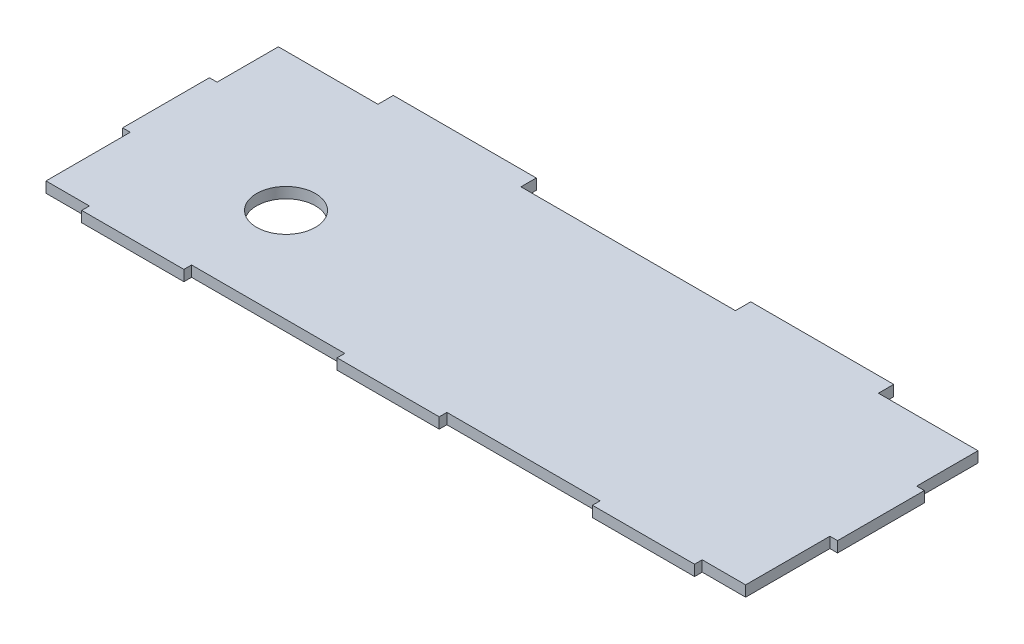
ISO-10303-21;
HEADER;
FILE_DESCRIPTION(('STEP AP214'),'2;1');
FILE_NAME('part.step','',(''),(''),'','','');
FILE_SCHEMA(('AUTOMOTIVE_DESIGN { 1 0 10303 214 1 1 1 1 }'));
ENDSEC;
DATA;
#1=APPLICATION_CONTEXT('core data for automotive mechanical design processes');
#2=APPLICATION_PROTOCOL_DEFINITION('international standard','automotive_design',2000,#1);
#3=PRODUCT_CONTEXT('',#1,'mechanical');
#4=PRODUCT('Part','Part','',(#3));
#5=PRODUCT_RELATED_PRODUCT_CATEGORY('part','',(#4));
#6=PRODUCT_DEFINITION_FORMATION('','',#4);
#7=PRODUCT_DEFINITION_CONTEXT('part definition',#1,'design');
#8=PRODUCT_DEFINITION('design','',#6,#7);
#9=PRODUCT_DEFINITION_SHAPE('','',#8);
#10=(LENGTH_UNIT() NAMED_UNIT(*) SI_UNIT(.MILLI.,.METRE.));
#11=(NAMED_UNIT(*) PLANE_ANGLE_UNIT() SI_UNIT($,.RADIAN.));
#12=(NAMED_UNIT(*) SI_UNIT($,.STERADIAN.) SOLID_ANGLE_UNIT());
#13=UNCERTAINTY_MEASURE_WITH_UNIT(LENGTH_MEASURE(1.E-05),#10,'distance_accuracy_value','');
#14=(GEOMETRIC_REPRESENTATION_CONTEXT(3) GLOBAL_UNCERTAINTY_ASSIGNED_CONTEXT((#13)) GLOBAL_UNIT_ASSIGNED_CONTEXT((#10,
#11,#12)) REPRESENTATION_CONTEXT('',''));
#15=CARTESIAN_POINT('',(0.,0.,0.));
#16=DIRECTION('',(0.,0.,1.));
#17=DIRECTION('',(1.,0.,0.));
#18=AXIS2_PLACEMENT_3D('',#15,#16,#17);
#19=CARTESIAN_POINT('',(-70.,2.1,23.5));
#20=DIRECTION('',(0.,0.,-1.));
#21=DIRECTION('',(-1.,0.,0.));
#22=AXIS2_PLACEMENT_3D('',#19,#20,#21);
#23=PLANE('',#22);
#24=DIRECTION('',(1.,0.,0.));
#25=VECTOR('',#24,1.);
#26=CARTESIAN_POINT('',(-70.,0.,23.5));
#27=LINE('',#26,#25);
#28=CARTESIAN_POINT('',(-9.99999999999998,0.,23.5));
#29=VERTEX_POINT('',#28);
#30=CARTESIAN_POINT('',(10.,0.,23.5));
#31=VERTEX_POINT('',#30);
#32=EDGE_CURVE('E468',#29,#31,#27,.T.);
#33=ORIENTED_EDGE('',*,*,#32,.T.);
#34=DIRECTION('',(0.,1.,0.));
#35=VECTOR('',#34,1.);
#36=CARTESIAN_POINT('',(10.,0.,23.5));
#37=LINE('',#36,#35);
#38=CARTESIAN_POINT('',(10.,2.1,23.5));
#39=VERTEX_POINT('',#38);
#40=EDGE_CURVE('E327',#31,#39,#37,.T.);
#41=ORIENTED_EDGE('',*,*,#40,.T.);
#42=DIRECTION('',(1.,0.,0.));
#43=VECTOR('',#42,1.);
#44=CARTESIAN_POINT('',(-70.,2.1,23.5));
#45=LINE('',#44,#43);
#46=CARTESIAN_POINT('',(-9.99999999999998,2.1,23.5));
#47=VERTEX_POINT('',#46);
#48=EDGE_CURVE('E438',#47,#39,#45,.T.);
#49=ORIENTED_EDGE('',*,*,#48,.F.);
#50=DIRECTION('',(0.,1.,0.));
#51=VECTOR('',#50,1.);
#52=CARTESIAN_POINT('',(-9.99999999999998,0.,23.5));
#53=LINE('',#52,#51);
#54=EDGE_CURVE('E294',#29,#47,#53,.T.);
#55=ORIENTED_EDGE('',*,*,#54,.F.);
#56=EDGE_LOOP('',(#33,#41,#49,#55));
#57=FACE_BOUND('',#56,.T.);
#58=ADVANCED_FACE('F37',(#57),#23,.F.);
#59=CARTESIAN_POINT('',(-60.,0.,23.5));
#60=VERTEX_POINT('',#59);
#61=CARTESIAN_POINT('',(-40.,0.,23.5));
#62=VERTEX_POINT('',#61);
#63=EDGE_CURVE('E469',#60,#62,#27,.T.);
#64=ORIENTED_EDGE('',*,*,#63,.T.);
#65=DIRECTION('',(0.,1.,0.));
#66=VECTOR('',#65,1.);
#67=CARTESIAN_POINT('',(-40.,0.,23.5));
#68=LINE('',#67,#66);
#69=CARTESIAN_POINT('',(-40.,2.1,23.5));
#70=VERTEX_POINT('',#69);
#71=EDGE_CURVE('E301',#62,#70,#68,.T.);
#72=ORIENTED_EDGE('',*,*,#71,.T.);
#73=CARTESIAN_POINT('',(-60.,2.1,23.5));
#74=VERTEX_POINT('',#73);
#75=EDGE_CURVE('E439',#74,#70,#45,.T.);
#76=ORIENTED_EDGE('',*,*,#75,.F.);
#77=DIRECTION('',(0.,1.,0.));
#78=VECTOR('',#77,1.);
#79=CARTESIAN_POINT('',(-60.,0.,23.5));
#80=LINE('',#79,#78);
#81=EDGE_CURVE('E572',#60,#74,#80,.T.);
#82=ORIENTED_EDGE('',*,*,#81,.F.);
#83=EDGE_LOOP('',(#64,#72,#76,#82));
#84=FACE_BOUND('',#83,.T.);
#85=ADVANCED_FACE('F571',(#84),#23,.F.);
#86=CARTESIAN_POINT('',(49.,2.1,-23.5));
#87=DIRECTION('',(0.,0.,1.));
#88=DIRECTION('',(1.,0.,0.));
#89=AXIS2_PLACEMENT_3D('',#86,#87,#88);
#90=PLANE('',#89);
#91=DIRECTION('',(-1.,0.,0.));
#92=VECTOR('',#91,1.);
#93=CARTESIAN_POINT('',(49.,2.1,-23.5));
#94=LINE('',#93,#92);
#95=CARTESIAN_POINT('',(68.5,2.1,-23.5));
#96=VERTEX_POINT('',#95);
#97=CARTESIAN_POINT('',(49.,2.1,-23.5));
#98=VERTEX_POINT('',#97);
#99=EDGE_CURVE('E414',#96,#98,#94,.T.);
#100=ORIENTED_EDGE('',*,*,#99,.F.);
#101=DIRECTION('',(0.,1.,0.));
#102=VECTOR('',#101,1.);
#103=CARTESIAN_POINT('',(68.5,0.,-23.5));
#104=LINE('',#103,#102);
#105=CARTESIAN_POINT('',(68.5,0.,-23.5));
#106=VERTEX_POINT('',#105);
#107=EDGE_CURVE('E378',#106,#96,#104,.T.);
#108=ORIENTED_EDGE('',*,*,#107,.F.);
#109=DIRECTION('',(-1.,0.,0.));
#110=VECTOR('',#109,1.);
#111=CARTESIAN_POINT('',(49.,0.,-23.5));
#112=LINE('',#111,#110);
#113=CARTESIAN_POINT('',(49.,0.,-23.5));
#114=VERTEX_POINT('',#113);
#115=EDGE_CURVE('E411',#106,#114,#112,.T.);
#116=ORIENTED_EDGE('',*,*,#115,.T.);
#117=DIRECTION('',(0.,-1.,0.));
#118=VECTOR('',#117,1.);
#119=CARTESIAN_POINT('',(49.,2.1,-23.5));
#120=LINE('',#119,#118);
#121=EDGE_CURVE('E11',#98,#114,#120,.T.);
#122=ORIENTED_EDGE('',*,*,#121,.F.);
#123=EDGE_LOOP('',(#100,#108,#116,#122));
#124=FACE_BOUND('',#123,.T.);
#125=ADVANCED_FACE('F39',(#124),#90,.F.);
#126=CARTESIAN_POINT('',(49.,2.1,-26.5));
#127=DIRECTION('',(-1.,0.,0.));
#128=DIRECTION('',(0.,0.,1.));
#129=AXIS2_PLACEMENT_3D('',#126,#127,#128);
#130=PLANE('',#129);
#131=DIRECTION('',(0.,0.,-1.));
#132=VECTOR('',#131,1.);
#133=CARTESIAN_POINT('',(49.,0.,-26.5));
#134=LINE('',#133,#132);
#135=CARTESIAN_POINT('',(49.,0.,-26.5));
#136=VERTEX_POINT('',#135);
#137=EDGE_CURVE('E445',#114,#136,#134,.T.);
#138=ORIENTED_EDGE('',*,*,#137,.T.);
#139=DIRECTION('',(0.,-1.,0.));
#140=VECTOR('',#139,1.);
#141=CARTESIAN_POINT('',(49.,2.1,-26.5));
#142=LINE('',#141,#140);
#143=CARTESIAN_POINT('',(49.,2.1,-26.5));
#144=VERTEX_POINT('',#143);
#145=EDGE_CURVE('E45',#144,#136,#142,.T.);
#146=ORIENTED_EDGE('',*,*,#145,.F.);
#147=DIRECTION('',(0.,0.,-1.));
#148=VECTOR('',#147,1.);
#149=CARTESIAN_POINT('',(49.,2.1,-26.5));
#150=LINE('',#149,#148);
#151=EDGE_CURVE('E416',#98,#144,#150,.T.);
#152=ORIENTED_EDGE('',*,*,#151,.F.);
#153=ORIENTED_EDGE('',*,*,#121,.T.);
#154=EDGE_LOOP('',(#138,#146,#152,#153));
#155=FACE_BOUND('',#154,.T.);
#156=ADVANCED_FACE('F517',(#155),#130,.F.);
#157=CARTESIAN_POINT('',(21.,2.1,-26.5));
#158=DIRECTION('',(0.,0.,1.));
#159=DIRECTION('',(1.,0.,0.));
#160=AXIS2_PLACEMENT_3D('',#157,#158,#159);
#161=PLANE('',#160);
#162=DIRECTION('',(-1.,0.,0.));
#163=VECTOR('',#162,1.);
#164=CARTESIAN_POINT('',(21.,0.,-26.5));
#165=LINE('',#164,#163);
#166=CARTESIAN_POINT('',(21.,0.,-26.5));
#167=VERTEX_POINT('',#166);
#168=EDGE_CURVE('E447',#136,#167,#165,.T.);
#169=ORIENTED_EDGE('',*,*,#168,.T.);
#170=DIRECTION('',(0.,-1.,0.));
#171=VECTOR('',#170,1.);
#172=CARTESIAN_POINT('',(21.,2.1,-26.5));
#173=LINE('',#172,#171);
#174=CARTESIAN_POINT('',(21.,2.1,-26.5));
#175=VERTEX_POINT('',#174);
#176=EDGE_CURVE('E486',#175,#167,#173,.T.);
#177=ORIENTED_EDGE('',*,*,#176,.F.);
#178=DIRECTION('',(-1.,0.,0.));
#179=VECTOR('',#178,1.);
#180=CARTESIAN_POINT('',(21.,2.1,-26.5));
#181=LINE('',#180,#179);
#182=EDGE_CURVE('E419',#144,#175,#181,.T.);
#183=ORIENTED_EDGE('',*,*,#182,.F.);
#184=ORIENTED_EDGE('',*,*,#145,.T.);
#185=EDGE_LOOP('',(#169,#177,#183,#184));
#186=FACE_BOUND('',#185,.T.);
#187=ADVANCED_FACE('F493',(#186),#161,.F.);
#188=CARTESIAN_POINT('',(21.,2.1,-23.5));
#189=DIRECTION('',(1.,0.,0.));
#190=DIRECTION('',(0.,0.,-1.));
#191=AXIS2_PLACEMENT_3D('',#188,#189,#190);
#192=PLANE('',#191);
#193=DIRECTION('',(0.,0.,1.));
#194=VECTOR('',#193,1.);
#195=CARTESIAN_POINT('',(21.,0.,-23.5));
#196=LINE('',#195,#194);
#197=CARTESIAN_POINT('',(21.,0.,-23.5));
#198=VERTEX_POINT('',#197);
#199=EDGE_CURVE('E449',#167,#198,#196,.T.);
#200=ORIENTED_EDGE('',*,*,#199,.T.);
#201=DIRECTION('',(0.,-1.,0.));
#202=VECTOR('',#201,1.);
#203=CARTESIAN_POINT('',(21.,2.1,-23.5));
#204=LINE('',#203,#202);
#205=CARTESIAN_POINT('',(21.,2.1,-23.5));
#206=VERTEX_POINT('',#205);
#207=EDGE_CURVE('E483',#206,#198,#204,.T.);
#208=ORIENTED_EDGE('',*,*,#207,.F.);
#209=DIRECTION('',(0.,0.,1.));
#210=VECTOR('',#209,1.);
#211=CARTESIAN_POINT('',(21.,2.1,-23.5));
#212=LINE('',#211,#210);
#213=EDGE_CURVE('E421',#175,#206,#212,.T.);
#214=ORIENTED_EDGE('',*,*,#213,.F.);
#215=ORIENTED_EDGE('',*,*,#176,.T.);
#216=EDGE_LOOP('',(#200,#208,#214,#215));
#217=FACE_BOUND('',#216,.T.);
#218=ADVANCED_FACE('F506',(#217),#192,.F.);
#219=CARTESIAN_POINT('',(-21.,2.1,-23.5));
#220=DIRECTION('',(0.,0.,1.));
#221=DIRECTION('',(1.,0.,0.));
#222=AXIS2_PLACEMENT_3D('',#219,#220,#221);
#223=PLANE('',#222);
#224=DIRECTION('',(-1.,0.,0.));
#225=VECTOR('',#224,1.);
#226=CARTESIAN_POINT('',(-21.,0.,-23.5));
#227=LINE('',#226,#225);
#228=CARTESIAN_POINT('',(-21.,0.,-23.5));
#229=VERTEX_POINT('',#228);
#230=EDGE_CURVE('E451',#198,#229,#227,.T.);
#231=ORIENTED_EDGE('',*,*,#230,.T.);
#232=DIRECTION('',(0.,-1.,0.));
#233=VECTOR('',#232,1.);
#234=CARTESIAN_POINT('',(-21.,2.1,-23.5));
#235=LINE('',#234,#233);
#236=CARTESIAN_POINT('',(-21.,2.1,-23.5));
#237=VERTEX_POINT('',#236);
#238=EDGE_CURVE('E480',#237,#229,#235,.T.);
#239=ORIENTED_EDGE('',*,*,#238,.F.);
#240=DIRECTION('',(-1.,0.,0.));
#241=VECTOR('',#240,1.);
#242=CARTESIAN_POINT('',(-21.,2.1,-23.5));
#243=LINE('',#242,#241);
#244=EDGE_CURVE('E423',#206,#237,#243,.T.);
#245=ORIENTED_EDGE('',*,*,#244,.F.);
#246=ORIENTED_EDGE('',*,*,#207,.T.);
#247=EDGE_LOOP('',(#231,#239,#245,#246));
#248=FACE_BOUND('',#247,.T.);
#249=ADVANCED_FACE('F510',(#248),#223,.F.);
#250=CARTESIAN_POINT('',(-21.,2.1,-26.5));
#251=DIRECTION('',(-1.,0.,0.));
#252=DIRECTION('',(0.,0.,1.));
#253=AXIS2_PLACEMENT_3D('',#250,#251,#252);
#254=PLANE('',#253);
#255=DIRECTION('',(0.,0.,-1.));
#256=VECTOR('',#255,1.);
#257=CARTESIAN_POINT('',(-21.,0.,-26.5));
#258=LINE('',#257,#256);
#259=CARTESIAN_POINT('',(-21.,0.,-26.5));
#260=VERTEX_POINT('',#259);
#261=EDGE_CURVE('E453',#229,#260,#258,.T.);
#262=ORIENTED_EDGE('',*,*,#261,.T.);
#263=DIRECTION('',(0.,-1.,0.));
#264=VECTOR('',#263,1.);
#265=CARTESIAN_POINT('',(-21.,2.1,-26.5));
#266=LINE('',#265,#264);
#267=CARTESIAN_POINT('',(-21.,2.1,-26.5));
#268=VERTEX_POINT('',#267);
#269=EDGE_CURVE('E477',#268,#260,#266,.T.);
#270=ORIENTED_EDGE('',*,*,#269,.F.);
#271=DIRECTION('',(0.,0.,-1.));
#272=VECTOR('',#271,1.);
#273=CARTESIAN_POINT('',(-21.,2.1,-26.5));
#274=LINE('',#273,#272);
#275=EDGE_CURVE('E425',#237,#268,#274,.T.);
#276=ORIENTED_EDGE('',*,*,#275,.F.);
#277=ORIENTED_EDGE('',*,*,#238,.T.);
#278=EDGE_LOOP('',(#262,#270,#276,#277));
#279=FACE_BOUND('',#278,.T.);
#280=ADVANCED_FACE('F619',(#279),#254,.F.);
#281=CARTESIAN_POINT('',(-49.,2.1,-26.5));
#282=DIRECTION('',(0.,0.,1.));
#283=DIRECTION('',(1.,0.,0.));
#284=AXIS2_PLACEMENT_3D('',#281,#282,#283);
#285=PLANE('',#284);
#286=DIRECTION('',(-1.,0.,0.));
#287=VECTOR('',#286,1.);
#288=CARTESIAN_POINT('',(-49.,0.,-26.5));
#289=LINE('',#288,#287);
#290=CARTESIAN_POINT('',(-49.,0.,-26.5));
#291=VERTEX_POINT('',#290);
#292=EDGE_CURVE('E455',#260,#291,#289,.T.);
#293=ORIENTED_EDGE('',*,*,#292,.T.);
#294=DIRECTION('',(0.,-1.,0.));
#295=VECTOR('',#294,1.);
#296=CARTESIAN_POINT('',(-49.,2.1,-26.5));
#297=LINE('',#296,#295);
#298=CARTESIAN_POINT('',(-49.,2.1,-26.5));
#299=VERTEX_POINT('',#298);
#300=EDGE_CURVE('E474',#299,#291,#297,.T.);
#301=ORIENTED_EDGE('',*,*,#300,.F.);
#302=DIRECTION('',(-1.,0.,0.));
#303=VECTOR('',#302,1.);
#304=CARTESIAN_POINT('',(-49.,2.1,-26.5));
#305=LINE('',#304,#303);
#306=EDGE_CURVE('E427',#268,#299,#305,.T.);
#307=ORIENTED_EDGE('',*,*,#306,.F.);
#308=ORIENTED_EDGE('',*,*,#269,.T.);
#309=EDGE_LOOP('',(#293,#301,#307,#308));
#310=FACE_BOUND('',#309,.T.);
#311=ADVANCED_FACE('F615',(#310),#285,.F.);
#312=CARTESIAN_POINT('',(-49.,2.1,-23.5));
#313=DIRECTION('',(1.,0.,0.));
#314=DIRECTION('',(0.,0.,-1.));
#315=AXIS2_PLACEMENT_3D('',#312,#313,#314);
#316=PLANE('',#315);
#317=DIRECTION('',(0.,0.,1.));
#318=VECTOR('',#317,1.);
#319=CARTESIAN_POINT('',(-49.,0.,-23.5));
#320=LINE('',#319,#318);
#321=CARTESIAN_POINT('',(-49.,0.,-23.5));
#322=VERTEX_POINT('',#321);
#323=EDGE_CURVE('E457',#291,#322,#320,.T.);
#324=ORIENTED_EDGE('',*,*,#323,.T.);
#325=DIRECTION('',(0.,-1.,0.));
#326=VECTOR('',#325,1.);
#327=CARTESIAN_POINT('',(-49.,2.1,-23.5));
#328=LINE('',#327,#326);
#329=CARTESIAN_POINT('',(-49.,2.1,-23.5));
#330=VERTEX_POINT('',#329);
#331=EDGE_CURVE('E443',#330,#322,#328,.T.);
#332=ORIENTED_EDGE('',*,*,#331,.F.);
#333=DIRECTION('',(0.,0.,1.));
#334=VECTOR('',#333,1.);
#335=CARTESIAN_POINT('',(-49.,2.1,-23.5));
#336=LINE('',#335,#334);
#337=EDGE_CURVE('E429',#299,#330,#336,.T.);
#338=ORIENTED_EDGE('',*,*,#337,.F.);
#339=ORIENTED_EDGE('',*,*,#300,.T.);
#340=EDGE_LOOP('',(#324,#332,#338,#339));
#341=FACE_BOUND('',#340,.T.);
#342=ADVANCED_FACE('F609',(#341),#316,.F.);
#343=CARTESIAN_POINT('',(-70.,2.1,-23.5));
#344=DIRECTION('',(0.,0.,1.));
#345=DIRECTION('',(1.,0.,0.));
#346=AXIS2_PLACEMENT_3D('',#343,#344,#345);
#347=PLANE('',#346);
#348=DIRECTION('',(-1.,0.,0.));
#349=VECTOR('',#348,1.);
#350=CARTESIAN_POINT('',(-70.,0.,-23.5));
#351=LINE('',#350,#349);
#352=CARTESIAN_POINT('',(-68.5,0.,-23.5));
#353=VERTEX_POINT('',#352);
#354=EDGE_CURVE('E459',#322,#353,#351,.T.);
#355=ORIENTED_EDGE('',*,*,#354,.T.);
#356=DIRECTION('',(0.,1.,0.));
#357=VECTOR('',#356,1.);
#358=CARTESIAN_POINT('',(-68.5,0.,-23.5));
#359=LINE('',#358,#357);
#360=CARTESIAN_POINT('',(-68.5,2.1,-23.5));
#361=VERTEX_POINT('',#360);
#362=EDGE_CURVE('E401',#353,#361,#359,.T.);
#363=ORIENTED_EDGE('',*,*,#362,.T.);
#364=DIRECTION('',(-1.,0.,0.));
#365=VECTOR('',#364,1.);
#366=CARTESIAN_POINT('',(-70.,2.1,-23.5));
#367=LINE('',#366,#365);
#368=EDGE_CURVE('E431',#330,#361,#367,.T.);
#369=ORIENTED_EDGE('',*,*,#368,.F.);
#370=ORIENTED_EDGE('',*,*,#331,.T.);
#371=EDGE_LOOP('',(#355,#363,#369,#370));
#372=FACE_BOUND('',#371,.T.);
#373=ADVANCED_FACE('F604',(#372),#347,.F.);
#374=CARTESIAN_POINT('',(-70.,2.1,23.5));
#375=DIRECTION('',(1.,0.,0.));
#376=DIRECTION('',(0.,0.,-1.));
#377=AXIS2_PLACEMENT_3D('',#374,#375,#376);
#378=PLANE('',#377);
#379=DIRECTION('',(0.,0.,1.));
#380=VECTOR('',#379,1.);
#381=CARTESIAN_POINT('',(-70.,0.,23.5));
#382=LINE('',#381,#380);
#383=CARTESIAN_POINT('',(-70.,0.,-11.5));
#384=VERTEX_POINT('',#383);
#385=CARTESIAN_POINT('',(-70.,0.,5.5));
#386=VERTEX_POINT('',#385);
#387=EDGE_CURVE('E462',#384,#386,#382,.T.);
#388=ORIENTED_EDGE('',*,*,#387,.T.);
#389=DIRECTION('',(0.,1.,0.));
#390=VECTOR('',#389,1.);
#391=CARTESIAN_POINT('',(-70.,0.,5.5));
#392=LINE('',#391,#390);
#393=CARTESIAN_POINT('',(-70.,2.1,5.5));
#394=VERTEX_POINT('',#393);
#395=EDGE_CURVE('E287',#386,#394,#392,.T.);
#396=ORIENTED_EDGE('',*,*,#395,.T.);
#397=DIRECTION('',(0.,0.,1.));
#398=VECTOR('',#397,1.);
#399=CARTESIAN_POINT('',(-70.,2.1,23.5));
#400=LINE('',#399,#398);
#401=CARTESIAN_POINT('',(-70.,2.1,-11.5));
#402=VERTEX_POINT('',#401);
#403=EDGE_CURVE('E273',#402,#394,#400,.T.);
#404=ORIENTED_EDGE('',*,*,#403,.F.);
#405=DIRECTION('',(0.,1.,0.));
#406=VECTOR('',#405,1.);
#407=CARTESIAN_POINT('',(-70.,0.,-11.5));
#408=LINE('',#407,#406);
#409=EDGE_CURVE('E398',#384,#402,#408,.T.);
#410=ORIENTED_EDGE('',*,*,#409,.F.);
#411=EDGE_LOOP('',(#388,#396,#404,#410));
#412=FACE_BOUND('',#411,.T.);
#413=ADVANCED_FACE('F599',(#412),#378,.F.);
#414=CARTESIAN_POINT('',(40.,0.,23.5));
#415=VERTEX_POINT('',#414);
#416=CARTESIAN_POINT('',(60.,0.,23.5));
#417=VERTEX_POINT('',#416);
#418=EDGE_CURVE('E465',#415,#417,#27,.T.);
#419=ORIENTED_EDGE('',*,*,#418,.T.);
#420=DIRECTION('',(0.,1.,0.));
#421=VECTOR('',#420,1.);
#422=CARTESIAN_POINT('',(60.,0.,23.5));
#423=LINE('',#422,#421);
#424=CARTESIAN_POINT('',(60.,2.1,23.5));
#425=VERTEX_POINT('',#424);
#426=EDGE_CURVE('E346',#417,#425,#423,.T.);
#427=ORIENTED_EDGE('',*,*,#426,.T.);
#428=CARTESIAN_POINT('',(40.,2.1,23.5));
#429=VERTEX_POINT('',#428);
#430=EDGE_CURVE('E435',#429,#425,#45,.T.);
#431=ORIENTED_EDGE('',*,*,#430,.F.);
#432=DIRECTION('',(0.,1.,0.));
#433=VECTOR('',#432,1.);
#434=CARTESIAN_POINT('',(40.,0.,23.5));
#435=LINE('',#434,#433);
#436=EDGE_CURVE('E320',#415,#429,#435,.T.);
#437=ORIENTED_EDGE('',*,*,#436,.F.);
#438=EDGE_LOOP('',(#419,#427,#431,#437));
#439=FACE_BOUND('',#438,.T.);
#440=ADVANCED_FACE('F543',(#439),#23,.F.);
#441=CARTESIAN_POINT('',(70.,2.1,23.5));
#442=DIRECTION('',(-1.,0.,0.));
#443=DIRECTION('',(0.,0.,1.));
#444=AXIS2_PLACEMENT_3D('',#441,#442,#443);
#445=PLANE('',#444);
#446=DIRECTION('',(0.,0.,-1.));
#447=VECTOR('',#446,1.);
#448=CARTESIAN_POINT('',(70.,0.,23.5));
#449=LINE('',#448,#447);
#450=CARTESIAN_POINT('',(70.,0.,5.5));
#451=VERTEX_POINT('',#450);
#452=CARTESIAN_POINT('',(70.,0.,-11.5));
#453=VERTEX_POINT('',#452);
#454=EDGE_CURVE('E417',#451,#453,#449,.T.);
#455=ORIENTED_EDGE('',*,*,#454,.T.);
#456=DIRECTION('',(0.,1.,0.));
#457=VECTOR('',#456,1.);
#458=CARTESIAN_POINT('',(70.,0.,-11.5));
#459=LINE('',#458,#457);
#460=CARTESIAN_POINT('',(70.,2.1,-11.5));
#461=VERTEX_POINT('',#460);
#462=EDGE_CURVE('E382',#453,#461,#459,.T.);
#463=ORIENTED_EDGE('',*,*,#462,.T.);
#464=DIRECTION('',(0.,0.,-1.));
#465=VECTOR('',#464,1.);
#466=CARTESIAN_POINT('',(70.,2.1,23.5));
#467=LINE('',#466,#465);
#468=CARTESIAN_POINT('',(70.,2.1,5.5));
#469=VERTEX_POINT('',#468);
#470=EDGE_CURVE('E440',#469,#461,#467,.T.);
#471=ORIENTED_EDGE('',*,*,#470,.F.);
#472=DIRECTION('',(0.,1.,0.));
#473=VECTOR('',#472,1.);
#474=CARTESIAN_POINT('',(70.,0.,5.5));
#475=LINE('',#474,#473);
#476=EDGE_CURVE('E350',#451,#469,#475,.T.);
#477=ORIENTED_EDGE('',*,*,#476,.F.);
#478=EDGE_LOOP('',(#455,#463,#471,#477));
#479=FACE_BOUND('',#478,.T.);
#480=ADVANCED_FACE('F526',(#479),#445,.F.);
#481=CARTESIAN_POINT('',(0.,2.1,0.));
#482=DIRECTION('',(0.,1.,0.));
#483=DIRECTION('',(0.,0.,1.));
#484=AXIS2_PLACEMENT_3D('',#481,#482,#483);
#485=PLANE('',#484);
#486=DIRECTION('',(1.,0.,0.));
#487=VECTOR('',#486,1.);
#488=CARTESIAN_POINT('',(68.5,2.1,-11.5));
#489=LINE('',#488,#487);
#490=CARTESIAN_POINT('',(68.5,2.1,-11.5));
#491=VERTEX_POINT('',#490);
#492=EDGE_CURVE('E385',#491,#461,#489,.T.);
#493=ORIENTED_EDGE('',*,*,#492,.F.);
#494=DIRECTION('',(0.,0.,1.));
#495=VECTOR('',#494,1.);
#496=CARTESIAN_POINT('',(68.5,2.1,-23.5));
#497=LINE('',#496,#495);
#498=EDGE_CURVE('E358',#96,#491,#497,.T.);
#499=ORIENTED_EDGE('',*,*,#498,.F.);
#500=ORIENTED_EDGE('',*,*,#99,.T.);
#501=ORIENTED_EDGE('',*,*,#151,.T.);
#502=ORIENTED_EDGE('',*,*,#182,.T.);
#503=ORIENTED_EDGE('',*,*,#213,.T.);
#504=ORIENTED_EDGE('',*,*,#244,.T.);
#505=ORIENTED_EDGE('',*,*,#275,.T.);
#506=ORIENTED_EDGE('',*,*,#306,.T.);
#507=ORIENTED_EDGE('',*,*,#337,.T.);
#508=ORIENTED_EDGE('',*,*,#368,.T.);
#509=DIRECTION('',(0.,0.,-1.));
#510=VECTOR('',#509,1.);
#511=CARTESIAN_POINT('',(-68.5,2.1,-23.5));
#512=LINE('',#511,#510);
#513=CARTESIAN_POINT('',(-68.5,2.1,-11.5));
#514=VERTEX_POINT('',#513);
#515=EDGE_CURVE('E278',#514,#361,#512,.T.);
#516=ORIENTED_EDGE('',*,*,#515,.F.);
#517=DIRECTION('',(1.,0.,0.));
#518=VECTOR('',#517,1.);
#519=CARTESIAN_POINT('',(-68.5,2.1,-11.5));
#520=LINE('',#519,#518);
#521=EDGE_CURVE('E274',#402,#514,#520,.T.);
#522=ORIENTED_EDGE('',*,*,#521,.F.);
#523=ORIENTED_EDGE('',*,*,#403,.T.);
#524=DIRECTION('',(-1.,0.,0.));
#525=VECTOR('',#524,1.);
#526=CARTESIAN_POINT('',(-68.5,2.1,5.5));
#527=LINE('',#526,#525);
#528=CARTESIAN_POINT('',(-68.5,2.1,5.5));
#529=VERTEX_POINT('',#528);
#530=EDGE_CURVE('E249',#529,#394,#527,.T.);
#531=ORIENTED_EDGE('',*,*,#530,.F.);
#532=DIRECTION('',(0.,0.,-1.));
#533=VECTOR('',#532,1.);
#534=CARTESIAN_POINT('',(-68.5,2.1,22.));
#535=LINE('',#534,#533);
#536=CARTESIAN_POINT('',(-68.5,2.1,22.));
#537=VERTEX_POINT('',#536);
#538=EDGE_CURVE('E260',#537,#529,#535,.T.);
#539=ORIENTED_EDGE('',*,*,#538,.F.);
#540=DIRECTION('',(-1.,0.,0.));
#541=VECTOR('',#540,1.);
#542=CARTESIAN_POINT('',(-60.,2.1,22.));
#543=LINE('',#542,#541);
#544=CARTESIAN_POINT('',(-60.,2.1,22.));
#545=VERTEX_POINT('',#544);
#546=EDGE_CURVE('E265',#545,#537,#543,.T.);
#547=ORIENTED_EDGE('',*,*,#546,.F.);
#548=DIRECTION('',(0.,0.,-1.));
#549=VECTOR('',#548,1.);
#550=CARTESIAN_POINT('',(-60.,2.1,23.5));
#551=LINE('',#550,#549);
#552=EDGE_CURVE('E275',#74,#545,#551,.T.);
#553=ORIENTED_EDGE('',*,*,#552,.F.);
#554=ORIENTED_EDGE('',*,*,#75,.T.);
#555=DIRECTION('',(0.,0.,1.));
#556=VECTOR('',#555,1.);
#557=CARTESIAN_POINT('',(-40.,2.1,23.5));
#558=LINE('',#557,#556);
#559=CARTESIAN_POINT('',(-40.,2.1,22.));
#560=VERTEX_POINT('',#559);
#561=EDGE_CURVE('E305',#560,#70,#558,.T.);
#562=ORIENTED_EDGE('',*,*,#561,.F.);
#563=DIRECTION('',(-1.,0.,0.));
#564=VECTOR('',#563,1.);
#565=CARTESIAN_POINT('',(-40.,2.1,22.));
#566=LINE('',#565,#564);
#567=CARTESIAN_POINT('',(-9.99999999999998,2.1,22.));
#568=VERTEX_POINT('',#567);
#569=EDGE_CURVE('E307',#568,#560,#566,.T.);
#570=ORIENTED_EDGE('',*,*,#569,.F.);
#571=DIRECTION('',(0.,0.,-1.));
#572=VECTOR('',#571,1.);
#573=CARTESIAN_POINT('',(-9.99999999999998,2.1,22.));
#574=LINE('',#573,#572);
#575=EDGE_CURVE('E257',#47,#568,#574,.T.);
#576=ORIENTED_EDGE('',*,*,#575,.F.);
#577=ORIENTED_EDGE('',*,*,#48,.T.);
#578=DIRECTION('',(0.,0.,1.));
#579=VECTOR('',#578,1.);
#580=CARTESIAN_POINT('',(10.,2.1,23.5));
#581=LINE('',#580,#579);
#582=CARTESIAN_POINT('',(10.,2.1,22.));
#583=VERTEX_POINT('',#582);
#584=EDGE_CURVE('E331',#583,#39,#581,.T.);
#585=ORIENTED_EDGE('',*,*,#584,.F.);
#586=DIRECTION('',(-1.,0.,0.));
#587=VECTOR('',#586,1.);
#588=CARTESIAN_POINT('',(10.,2.1,22.));
#589=LINE('',#588,#587);
#590=CARTESIAN_POINT('',(40.,2.1,22.));
#591=VERTEX_POINT('',#590);
#592=EDGE_CURVE('E333',#591,#583,#589,.T.);
#593=ORIENTED_EDGE('',*,*,#592,.F.);
#594=DIRECTION('',(0.,0.,-1.));
#595=VECTOR('',#594,1.);
#596=CARTESIAN_POINT('',(40.,2.1,22.));
#597=LINE('',#596,#595);
#598=EDGE_CURVE('E304',#429,#591,#597,.T.);
#599=ORIENTED_EDGE('',*,*,#598,.F.);
#600=ORIENTED_EDGE('',*,*,#430,.T.);
#601=DIRECTION('',(0.,0.,1.));
#602=VECTOR('',#601,1.);
#603=CARTESIAN_POINT('',(60.,2.1,22.));
#604=LINE('',#603,#602);
#605=CARTESIAN_POINT('',(60.,2.1,22.));
#606=VERTEX_POINT('',#605);
#607=EDGE_CURVE('E330',#606,#425,#604,.T.);
#608=ORIENTED_EDGE('',*,*,#607,.F.);
#609=DIRECTION('',(-1.,0.,0.));
#610=VECTOR('',#609,1.);
#611=CARTESIAN_POINT('',(68.5,2.1,22.));
#612=LINE('',#611,#610);
#613=CARTESIAN_POINT('',(68.5,2.1,22.));
#614=VERTEX_POINT('',#613);
#615=EDGE_CURVE('E359',#614,#606,#612,.T.);
#616=ORIENTED_EDGE('',*,*,#615,.F.);
#617=DIRECTION('',(0.,0.,1.));
#618=VECTOR('',#617,1.);
#619=CARTESIAN_POINT('',(68.5,2.1,5.5));
#620=LINE('',#619,#618);
#621=CARTESIAN_POINT('',(68.5,2.1,5.5));
#622=VERTEX_POINT('',#621);
#623=EDGE_CURVE('E362',#622,#614,#620,.T.);
#624=ORIENTED_EDGE('',*,*,#623,.F.);
#625=DIRECTION('',(-1.,0.,0.));
#626=VECTOR('',#625,1.);
#627=CARTESIAN_POINT('',(70.,2.1,5.5));
#628=LINE('',#627,#626);
#629=EDGE_CURVE('E366',#469,#622,#628,.T.);
#630=ORIENTED_EDGE('',*,*,#629,.F.);
#631=ORIENTED_EDGE('',*,*,#470,.T.);
#632=EDGE_LOOP('',(#493,#499,#500,#501,#502,#503,#504,#505,#506,#507,#508,#516,#522,#523,#531,
#539,#547,#553,#554,#562,#570,#576,#577,#585,#593,#599,#600,#608,#616,#624,#630,#631));
#633=FACE_BOUND('',#632,.T.);
#634=CARTESIAN_POINT('',(-40.,2.1,3.5));
#635=DIRECTION('',(0.,1.,0.));
#636=DIRECTION('',(0.,0.,1.));
#637=AXIS2_PLACEMENT_3D('',#634,#635,#636);
#638=CIRCLE('',#637,5.75);
#639=CARTESIAN_POINT('',(-40.,2.1,9.24999999999999));
#640=VERTEX_POINT('',#639);
#641=EDGE_CURVE('E404',#640,#640,#638,.T.);
#642=ORIENTED_EDGE('',*,*,#641,.F.);
#643=EDGE_LOOP('',(#642));
#644=FACE_BOUND('',#643,.T.);
#645=ADVANCED_FACE('F269',(#633,#644),#485,.T.);
#646=CARTESIAN_POINT('',(0.,0.,0.));
#647=DIRECTION('',(0.,1.,0.));
#648=DIRECTION('',(0.,0.,1.));
#649=AXIS2_PLACEMENT_3D('',#646,#647,#648);
#650=PLANE('',#649);
#651=CARTESIAN_POINT('',(-40.,0.,3.5));
#652=DIRECTION('',(0.,1.,0.));
#653=DIRECTION('',(0.,0.,1.));
#654=AXIS2_PLACEMENT_3D('',#651,#652,#653);
#655=CIRCLE('',#654,5.75);
#656=CARTESIAN_POINT('',(-40.,0.,9.24999999999999));
#657=VERTEX_POINT('',#656);
#658=EDGE_CURVE('E408',#657,#657,#655,.T.);
#659=ORIENTED_EDGE('',*,*,#658,.T.);
#660=EDGE_LOOP('',(#659));
#661=FACE_BOUND('',#660,.T.);
#662=DIRECTION('',(0.,0.,1.));
#663=VECTOR('',#662,1.);
#664=CARTESIAN_POINT('',(68.5,0.,-23.5));
#665=LINE('',#664,#663);
#666=CARTESIAN_POINT('',(68.5,0.,-11.5));
#667=VERTEX_POINT('',#666);
#668=EDGE_CURVE('E387',#106,#667,#665,.T.);
#669=ORIENTED_EDGE('',*,*,#668,.T.);
#670=DIRECTION('',(1.,0.,0.));
#671=VECTOR('',#670,1.);
#672=CARTESIAN_POINT('',(68.5,0.,-11.5));
#673=LINE('',#672,#671);
#674=EDGE_CURVE('E52',#667,#453,#673,.T.);
#675=ORIENTED_EDGE('',*,*,#674,.T.);
#676=ORIENTED_EDGE('',*,*,#454,.F.);
#677=DIRECTION('',(-1.,0.,0.));
#678=VECTOR('',#677,1.);
#679=CARTESIAN_POINT('',(70.,0.,5.5));
#680=LINE('',#679,#678);
#681=CARTESIAN_POINT('',(68.5,0.,5.5));
#682=VERTEX_POINT('',#681);
#683=EDGE_CURVE('E373',#451,#682,#680,.T.);
#684=ORIENTED_EDGE('',*,*,#683,.T.);
#685=DIRECTION('',(0.,0.,1.));
#686=VECTOR('',#685,1.);
#687=CARTESIAN_POINT('',(68.5,0.,5.5));
#688=LINE('',#687,#686);
#689=CARTESIAN_POINT('',(68.5,0.,22.));
#690=VERTEX_POINT('',#689);
#691=EDGE_CURVE('E60',#682,#690,#688,.T.);
#692=ORIENTED_EDGE('',*,*,#691,.T.);
#693=DIRECTION('',(-1.,0.,0.));
#694=VECTOR('',#693,1.);
#695=CARTESIAN_POINT('',(68.5,0.,22.));
#696=LINE('',#695,#694);
#697=CARTESIAN_POINT('',(60.,0.,22.));
#698=VERTEX_POINT('',#697);
#699=EDGE_CURVE('E349',#690,#698,#696,.T.);
#700=ORIENTED_EDGE('',*,*,#699,.T.);
#701=DIRECTION('',(0.,0.,1.));
#702=VECTOR('',#701,1.);
#703=CARTESIAN_POINT('',(60.,0.,22.));
#704=LINE('',#703,#702);
#705=EDGE_CURVE('E363',#698,#417,#704,.T.);
#706=ORIENTED_EDGE('',*,*,#705,.T.);
#707=ORIENTED_EDGE('',*,*,#418,.F.);
#708=DIRECTION('',(0.,0.,-1.));
#709=VECTOR('',#708,1.);
#710=CARTESIAN_POINT('',(40.,0.,22.));
#711=LINE('',#710,#709);
#712=CARTESIAN_POINT('',(40.,0.,22.));
#713=VERTEX_POINT('',#712);
#714=EDGE_CURVE('E334',#415,#713,#711,.T.);
#715=ORIENTED_EDGE('',*,*,#714,.T.);
#716=DIRECTION('',(-1.,0.,0.));
#717=VECTOR('',#716,1.);
#718=CARTESIAN_POINT('',(10.,0.,22.));
#719=LINE('',#718,#717);
#720=CARTESIAN_POINT('',(10.,0.,22.));
#721=VERTEX_POINT('',#720);
#722=EDGE_CURVE('E341',#713,#721,#719,.T.);
#723=ORIENTED_EDGE('',*,*,#722,.T.);
#724=DIRECTION('',(0.,0.,1.));
#725=VECTOR('',#724,1.);
#726=CARTESIAN_POINT('',(10.,0.,23.5));
#727=LINE('',#726,#725);
#728=EDGE_CURVE('E322',#721,#31,#727,.T.);
#729=ORIENTED_EDGE('',*,*,#728,.T.);
#730=ORIENTED_EDGE('',*,*,#32,.F.);
#731=DIRECTION('',(0.,0.,-1.));
#732=VECTOR('',#731,1.);
#733=CARTESIAN_POINT('',(-9.99999999999998,0.,22.));
#734=LINE('',#733,#732);
#735=CARTESIAN_POINT('',(-9.99999999999998,0.,22.));
#736=VERTEX_POINT('',#735);
#737=EDGE_CURVE('E308',#29,#736,#734,.T.);
#738=ORIENTED_EDGE('',*,*,#737,.T.);
#739=DIRECTION('',(-1.,0.,0.));
#740=VECTOR('',#739,1.);
#741=CARTESIAN_POINT('',(-40.,0.,22.));
#742=LINE('',#741,#740);
#743=CARTESIAN_POINT('',(-40.,0.,22.));
#744=VERTEX_POINT('',#743);
#745=EDGE_CURVE('E315',#736,#744,#742,.T.);
#746=ORIENTED_EDGE('',*,*,#745,.T.);
#747=DIRECTION('',(0.,0.,1.));
#748=VECTOR('',#747,1.);
#749=CARTESIAN_POINT('',(-40.,0.,23.5));
#750=LINE('',#749,#748);
#751=EDGE_CURVE('E296',#744,#62,#750,.T.);
#752=ORIENTED_EDGE('',*,*,#751,.T.);
#753=ORIENTED_EDGE('',*,*,#63,.F.);
#754=DIRECTION('',(0.,0.,-1.));
#755=VECTOR('',#754,1.);
#756=CARTESIAN_POINT('',(-60.,0.,23.5));
#757=LINE('',#756,#755);
#758=CARTESIAN_POINT('',(-60.,0.,22.));
#759=VERTEX_POINT('',#758);
#760=EDGE_CURVE('E290',#60,#759,#757,.T.);
#761=ORIENTED_EDGE('',*,*,#760,.T.);
#762=DIRECTION('',(-1.,0.,0.));
#763=VECTOR('',#762,1.);
#764=CARTESIAN_POINT('',(-60.,0.,22.));
#765=LINE('',#764,#763);
#766=CARTESIAN_POINT('',(-68.5,0.,22.));
#767=VERTEX_POINT('',#766);
#768=EDGE_CURVE('E286',#759,#767,#765,.T.);
#769=ORIENTED_EDGE('',*,*,#768,.T.);
#770=DIRECTION('',(0.,0.,-1.));
#771=VECTOR('',#770,1.);
#772=CARTESIAN_POINT('',(-68.5,0.,22.));
#773=LINE('',#772,#771);
#774=CARTESIAN_POINT('',(-68.5,0.,5.5));
#775=VERTEX_POINT('',#774);
#776=EDGE_CURVE('E284',#767,#775,#773,.T.);
#777=ORIENTED_EDGE('',*,*,#776,.T.);
#778=DIRECTION('',(-1.,0.,0.));
#779=VECTOR('',#778,1.);
#780=CARTESIAN_POINT('',(-68.5,0.,5.5));
#781=LINE('',#780,#779);
#782=EDGE_CURVE('E252',#775,#386,#781,.T.);
#783=ORIENTED_EDGE('',*,*,#782,.T.);
#784=ORIENTED_EDGE('',*,*,#387,.F.);
#785=DIRECTION('',(1.,0.,0.));
#786=VECTOR('',#785,1.);
#787=CARTESIAN_POINT('',(-68.5,0.,-11.5));
#788=LINE('',#787,#786);
#789=CARTESIAN_POINT('',(-68.5,0.,-11.5));
#790=VERTEX_POINT('',#789);
#791=EDGE_CURVE('E393',#384,#790,#788,.T.);
#792=ORIENTED_EDGE('',*,*,#791,.T.);
#793=DIRECTION('',(0.,0.,-1.));
#794=VECTOR('',#793,1.);
#795=CARTESIAN_POINT('',(-68.5,0.,-23.5));
#796=LINE('',#795,#794);
#797=EDGE_CURVE('E396',#790,#353,#796,.T.);
#798=ORIENTED_EDGE('',*,*,#797,.T.);
#799=ORIENTED_EDGE('',*,*,#354,.F.);
#800=ORIENTED_EDGE('',*,*,#323,.F.);
#801=ORIENTED_EDGE('',*,*,#292,.F.);
#802=ORIENTED_EDGE('',*,*,#261,.F.);
#803=ORIENTED_EDGE('',*,*,#230,.F.);
#804=ORIENTED_EDGE('',*,*,#199,.F.);
#805=ORIENTED_EDGE('',*,*,#168,.F.);
#806=ORIENTED_EDGE('',*,*,#137,.F.);
#807=ORIENTED_EDGE('',*,*,#115,.F.);
#808=EDGE_LOOP('',(#669,#675,#676,#684,#692,#700,#706,#707,#715,#723,#729,#730,#738,#746,#752,
#753,#761,#769,#777,#783,#784,#792,#798,#799,#800,#801,#802,#803,#804,#805,#806,#807));
#809=FACE_BOUND('',#808,.T.);
#810=ADVANCED_FACE('F500',(#661,#809),#650,.F.);
#811=CARTESIAN_POINT('',(-40.,0.,3.5));
#812=DIRECTION('',(0.,1.,0.));
#813=DIRECTION('',(0.,0.,1.));
#814=AXIS2_PLACEMENT_3D('',#811,#812,#813);
#815=CYLINDRICAL_SURFACE('',#814,5.75);
#816=ORIENTED_EDGE('',*,*,#658,.F.);
#817=EDGE_LOOP('',(#816));
#818=FACE_BOUND('',#817,.T.);
#819=ORIENTED_EDGE('',*,*,#641,.T.);
#820=EDGE_LOOP('',(#819));
#821=FACE_BOUND('',#820,.T.);
#822=ADVANCED_FACE('F651',(#818,#821),#815,.F.);
#823=CARTESIAN_POINT('',(-68.5,0.,-23.5));
#824=DIRECTION('',(1.,0.,0.));
#825=DIRECTION('',(0.,0.,-1.));
#826=AXIS2_PLACEMENT_3D('',#823,#824,#825);
#827=PLANE('',#826);
#828=ORIENTED_EDGE('',*,*,#515,.T.);
#829=ORIENTED_EDGE('',*,*,#362,.F.);
#830=ORIENTED_EDGE('',*,*,#797,.F.);
#831=DIRECTION('',(0.,1.,0.));
#832=VECTOR('',#831,1.);
#833=CARTESIAN_POINT('',(-68.5,0.,-11.5));
#834=LINE('',#833,#832);
#835=EDGE_CURVE('E405',#790,#514,#834,.T.);
#836=ORIENTED_EDGE('',*,*,#835,.T.);
#837=EDGE_LOOP('',(#828,#829,#830,#836));
#838=FACE_BOUND('',#837,.T.);
#839=ADVANCED_FACE('F656',(#838),#827,.F.);
#840=CARTESIAN_POINT('',(-68.5,0.,-11.5));
#841=DIRECTION('',(0.,0.,1.));
#842=DIRECTION('',(1.,0.,0.));
#843=AXIS2_PLACEMENT_3D('',#840,#841,#842);
#844=PLANE('',#843);
#845=ORIENTED_EDGE('',*,*,#521,.T.);
#846=ORIENTED_EDGE('',*,*,#835,.F.);
#847=ORIENTED_EDGE('',*,*,#791,.F.);
#848=ORIENTED_EDGE('',*,*,#409,.T.);
#849=EDGE_LOOP('',(#845,#846,#847,#848));
#850=FACE_BOUND('',#849,.T.);
#851=ADVANCED_FACE('F766',(#850),#844,.F.);
#852=CARTESIAN_POINT('',(-68.5,0.,5.5));
#853=DIRECTION('',(0.,0.,-1.));
#854=DIRECTION('',(-1.,0.,0.));
#855=AXIS2_PLACEMENT_3D('',#852,#853,#854);
#856=PLANE('',#855);
#857=ORIENTED_EDGE('',*,*,#530,.T.);
#858=ORIENTED_EDGE('',*,*,#395,.F.);
#859=ORIENTED_EDGE('',*,*,#782,.F.);
#860=DIRECTION('',(0.,1.,0.));
#861=VECTOR('',#860,1.);
#862=CARTESIAN_POINT('',(-68.5,0.,5.5));
#863=LINE('',#862,#861);
#864=EDGE_CURVE('E245',#775,#529,#863,.T.);
#865=ORIENTED_EDGE('',*,*,#864,.T.);
#866=EDGE_LOOP('',(#857,#858,#859,#865));
#867=FACE_BOUND('',#866,.T.);
#868=ADVANCED_FACE('F247',(#867),#856,.F.);
#869=CARTESIAN_POINT('',(-68.5,0.,22.));
#870=DIRECTION('',(1.,0.,0.));
#871=DIRECTION('',(0.,0.,-1.));
#872=AXIS2_PLACEMENT_3D('',#869,#870,#871);
#873=PLANE('',#872);
#874=ORIENTED_EDGE('',*,*,#538,.T.);
#875=ORIENTED_EDGE('',*,*,#864,.F.);
#876=ORIENTED_EDGE('',*,*,#776,.F.);
#877=DIRECTION('',(0.,1.,0.));
#878=VECTOR('',#877,1.);
#879=CARTESIAN_POINT('',(-68.5,0.,22.));
#880=LINE('',#879,#878);
#881=EDGE_CURVE('E256',#767,#537,#880,.T.);
#882=ORIENTED_EDGE('',*,*,#881,.T.);
#883=EDGE_LOOP('',(#874,#875,#876,#882));
#884=FACE_BOUND('',#883,.T.);
#885=ADVANCED_FACE('F261',(#884),#873,.F.);
#886=CARTESIAN_POINT('',(-60.,0.,22.));
#887=DIRECTION('',(0.,0.,-1.));
#888=DIRECTION('',(-1.,0.,0.));
#889=AXIS2_PLACEMENT_3D('',#886,#887,#888);
#890=PLANE('',#889);
#891=ORIENTED_EDGE('',*,*,#546,.T.);
#892=ORIENTED_EDGE('',*,*,#881,.F.);
#893=ORIENTED_EDGE('',*,*,#768,.F.);
#894=DIRECTION('',(0.,1.,0.));
#895=VECTOR('',#894,1.);
#896=CARTESIAN_POINT('',(-60.,0.,22.));
#897=LINE('',#896,#895);
#898=EDGE_CURVE('E940',#759,#545,#897,.T.);
#899=ORIENTED_EDGE('',*,*,#898,.T.);
#900=EDGE_LOOP('',(#891,#892,#893,#899));
#901=FACE_BOUND('',#900,.T.);
#902=ADVANCED_FACE('F795',(#901),#890,.F.);
#903=CARTESIAN_POINT('',(-60.,0.,23.5));
#904=DIRECTION('',(1.,0.,0.));
#905=DIRECTION('',(0.,0.,-1.));
#906=AXIS2_PLACEMENT_3D('',#903,#904,#905);
#907=PLANE('',#906);
#908=ORIENTED_EDGE('',*,*,#552,.T.);
#909=ORIENTED_EDGE('',*,*,#898,.F.);
#910=ORIENTED_EDGE('',*,*,#760,.F.);
#911=ORIENTED_EDGE('',*,*,#81,.T.);
#912=EDGE_LOOP('',(#908,#909,#910,#911));
#913=FACE_BOUND('',#912,.T.);
#914=ADVANCED_FACE('F804',(#913),#907,.F.);
#915=CARTESIAN_POINT('',(-40.,0.,23.5));
#916=DIRECTION('',(-1.,0.,0.));
#917=DIRECTION('',(0.,0.,1.));
#918=AXIS2_PLACEMENT_3D('',#915,#916,#917);
#919=PLANE('',#918);
#920=ORIENTED_EDGE('',*,*,#561,.T.);
#921=ORIENTED_EDGE('',*,*,#71,.F.);
#922=ORIENTED_EDGE('',*,*,#751,.F.);
#923=DIRECTION('',(0.,1.,0.));
#924=VECTOR('',#923,1.);
#925=CARTESIAN_POINT('',(-40.,0.,22.));
#926=LINE('',#925,#924);
#927=EDGE_CURVE('E299',#744,#560,#926,.T.);
#928=ORIENTED_EDGE('',*,*,#927,.T.);
#929=EDGE_LOOP('',(#920,#921,#922,#928));
#930=FACE_BOUND('',#929,.T.);
#931=ADVANCED_FACE('F576',(#930),#919,.F.);
#932=CARTESIAN_POINT('',(-40.,0.,22.));
#933=DIRECTION('',(0.,0.,-1.));
#934=DIRECTION('',(-1.,0.,0.));
#935=AXIS2_PLACEMENT_3D('',#932,#933,#934);
#936=PLANE('',#935);
#937=ORIENTED_EDGE('',*,*,#569,.T.);
#938=ORIENTED_EDGE('',*,*,#927,.F.);
#939=ORIENTED_EDGE('',*,*,#745,.F.);
#940=DIRECTION('',(0.,1.,0.));
#941=VECTOR('',#940,1.);
#942=CARTESIAN_POINT('',(-9.99999999999998,0.,22.));
#943=LINE('',#942,#941);
#944=EDGE_CURVE('E297',#736,#568,#943,.T.);
#945=ORIENTED_EDGE('',*,*,#944,.T.);
#946=EDGE_LOOP('',(#937,#938,#939,#945));
#947=FACE_BOUND('',#946,.T.);
#948=ADVANCED_FACE('F579',(#947),#936,.F.);
#949=CARTESIAN_POINT('',(-9.99999999999998,0.,22.));
#950=DIRECTION('',(1.,0.,0.));
#951=DIRECTION('',(0.,0.,-1.));
#952=AXIS2_PLACEMENT_3D('',#949,#950,#951);
#953=PLANE('',#952);
#954=ORIENTED_EDGE('',*,*,#575,.T.);
#955=ORIENTED_EDGE('',*,*,#944,.F.);
#956=ORIENTED_EDGE('',*,*,#737,.F.);
#957=ORIENTED_EDGE('',*,*,#54,.T.);
#958=EDGE_LOOP('',(#954,#955,#956,#957));
#959=FACE_BOUND('',#958,.T.);
#960=ADVANCED_FACE('F581',(#959),#953,.F.);
#961=CARTESIAN_POINT('',(10.,0.,23.5));
#962=DIRECTION('',(-1.,0.,0.));
#963=DIRECTION('',(0.,0.,1.));
#964=AXIS2_PLACEMENT_3D('',#961,#962,#963);
#965=PLANE('',#964);
#966=ORIENTED_EDGE('',*,*,#584,.T.);
#967=ORIENTED_EDGE('',*,*,#40,.F.);
#968=ORIENTED_EDGE('',*,*,#728,.F.);
#969=DIRECTION('',(0.,1.,0.));
#970=VECTOR('',#969,1.);
#971=CARTESIAN_POINT('',(10.,0.,22.));
#972=LINE('',#971,#970);
#973=EDGE_CURVE('E325',#721,#583,#972,.T.);
#974=ORIENTED_EDGE('',*,*,#973,.T.);
#975=EDGE_LOOP('',(#966,#967,#968,#974));
#976=FACE_BOUND('',#975,.T.);
#977=ADVANCED_FACE('F557',(#976),#965,.F.);
#978=CARTESIAN_POINT('',(10.,0.,22.));
#979=DIRECTION('',(0.,0.,-1.));
#980=DIRECTION('',(-1.,0.,0.));
#981=AXIS2_PLACEMENT_3D('',#978,#979,#980);
#982=PLANE('',#981);
#983=ORIENTED_EDGE('',*,*,#592,.T.);
#984=ORIENTED_EDGE('',*,*,#973,.F.);
#985=ORIENTED_EDGE('',*,*,#722,.F.);
#986=DIRECTION('',(0.,1.,0.));
#987=VECTOR('',#986,1.);
#988=CARTESIAN_POINT('',(40.,0.,22.));
#989=LINE('',#988,#987);
#990=EDGE_CURVE('E323',#713,#591,#989,.T.);
#991=ORIENTED_EDGE('',*,*,#990,.T.);
#992=EDGE_LOOP('',(#983,#984,#985,#991));
#993=FACE_BOUND('',#992,.T.);
#994=ADVANCED_FACE('F555',(#993),#982,.F.);
#995=CARTESIAN_POINT('',(40.,0.,22.));
#996=DIRECTION('',(1.,0.,0.));
#997=DIRECTION('',(0.,0.,-1.));
#998=AXIS2_PLACEMENT_3D('',#995,#996,#997);
#999=PLANE('',#998);
#1000=ORIENTED_EDGE('',*,*,#598,.T.);
#1001=ORIENTED_EDGE('',*,*,#990,.F.);
#1002=ORIENTED_EDGE('',*,*,#714,.F.);
#1003=ORIENTED_EDGE('',*,*,#436,.T.);
#1004=EDGE_LOOP('',(#1000,#1001,#1002,#1003));
#1005=FACE_BOUND('',#1004,.T.);
#1006=ADVANCED_FACE('F550',(#1005),#999,.F.);
#1007=CARTESIAN_POINT('',(60.,0.,22.));
#1008=DIRECTION('',(-1.,0.,0.));
#1009=DIRECTION('',(0.,0.,1.));
#1010=AXIS2_PLACEMENT_3D('',#1007,#1008,#1009);
#1011=PLANE('',#1010);
#1012=ORIENTED_EDGE('',*,*,#607,.T.);
#1013=ORIENTED_EDGE('',*,*,#426,.F.);
#1014=ORIENTED_EDGE('',*,*,#705,.F.);
#1015=DIRECTION('',(0.,1.,0.));
#1016=VECTOR('',#1015,1.);
#1017=CARTESIAN_POINT('',(60.,0.,22.));
#1018=LINE('',#1017,#1016);
#1019=EDGE_CURVE('E356',#698,#606,#1018,.T.);
#1020=ORIENTED_EDGE('',*,*,#1019,.T.);
#1021=EDGE_LOOP('',(#1012,#1013,#1014,#1020));
#1022=FACE_BOUND('',#1021,.T.);
#1023=ADVANCED_FACE('F540',(#1022),#1011,.F.);
#1024=CARTESIAN_POINT('',(68.5,0.,22.));
#1025=DIRECTION('',(0.,0.,-1.));
#1026=DIRECTION('',(-1.,0.,0.));
#1027=AXIS2_PLACEMENT_3D('',#1024,#1025,#1026);
#1028=PLANE('',#1027);
#1029=ORIENTED_EDGE('',*,*,#615,.T.);
#1030=ORIENTED_EDGE('',*,*,#1019,.F.);
#1031=ORIENTED_EDGE('',*,*,#699,.F.);
#1032=DIRECTION('',(0.,1.,0.));
#1033=VECTOR('',#1032,1.);
#1034=CARTESIAN_POINT('',(68.5,0.,22.));
#1035=LINE('',#1034,#1033);
#1036=EDGE_CURVE('E354',#690,#614,#1035,.T.);
#1037=ORIENTED_EDGE('',*,*,#1036,.T.);
#1038=EDGE_LOOP('',(#1029,#1030,#1031,#1037));
#1039=FACE_BOUND('',#1038,.T.);
#1040=ADVANCED_FACE('F537',(#1039),#1028,.F.);
#1041=CARTESIAN_POINT('',(68.5,0.,5.5));
#1042=DIRECTION('',(-1.,0.,0.));
#1043=DIRECTION('',(0.,0.,1.));
#1044=AXIS2_PLACEMENT_3D('',#1041,#1042,#1043);
#1045=PLANE('',#1044);
#1046=ORIENTED_EDGE('',*,*,#623,.T.);
#1047=ORIENTED_EDGE('',*,*,#1036,.F.);
#1048=ORIENTED_EDGE('',*,*,#691,.F.);
#1049=DIRECTION('',(0.,1.,0.));
#1050=VECTOR('',#1049,1.);
#1051=CARTESIAN_POINT('',(68.5,0.,5.5));
#1052=LINE('',#1051,#1050);
#1053=EDGE_CURVE('E352',#682,#622,#1052,.T.);
#1054=ORIENTED_EDGE('',*,*,#1053,.T.);
#1055=EDGE_LOOP('',(#1046,#1047,#1048,#1054));
#1056=FACE_BOUND('',#1055,.T.);
#1057=ADVANCED_FACE('F880',(#1056),#1045,.F.);
#1058=CARTESIAN_POINT('',(70.,0.,5.5));
#1059=DIRECTION('',(0.,0.,-1.));
#1060=DIRECTION('',(-1.,0.,0.));
#1061=AXIS2_PLACEMENT_3D('',#1058,#1059,#1060);
#1062=PLANE('',#1061);
#1063=ORIENTED_EDGE('',*,*,#629,.T.);
#1064=ORIENTED_EDGE('',*,*,#1053,.F.);
#1065=ORIENTED_EDGE('',*,*,#683,.F.);
#1066=ORIENTED_EDGE('',*,*,#476,.T.);
#1067=EDGE_LOOP('',(#1063,#1064,#1065,#1066));
#1068=FACE_BOUND('',#1067,.T.);
#1069=ADVANCED_FACE('F532',(#1068),#1062,.F.);
#1070=CARTESIAN_POINT('',(68.5,0.,-11.5));
#1071=DIRECTION('',(0.,0.,1.));
#1072=DIRECTION('',(1.,0.,0.));
#1073=AXIS2_PLACEMENT_3D('',#1070,#1071,#1072);
#1074=PLANE('',#1073);
#1075=ORIENTED_EDGE('',*,*,#492,.T.);
#1076=ORIENTED_EDGE('',*,*,#462,.F.);
#1077=ORIENTED_EDGE('',*,*,#674,.F.);
#1078=DIRECTION('',(0.,1.,0.));
#1079=VECTOR('',#1078,1.);
#1080=CARTESIAN_POINT('',(68.5,0.,-11.5));
#1081=LINE('',#1080,#1079);
#1082=EDGE_CURVE('E380',#667,#491,#1081,.T.);
#1083=ORIENTED_EDGE('',*,*,#1082,.T.);
#1084=EDGE_LOOP('',(#1075,#1076,#1077,#1083));
#1085=FACE_BOUND('',#1084,.T.);
#1086=ADVANCED_FACE('F523',(#1085),#1074,.F.);
#1087=CARTESIAN_POINT('',(68.5,0.,-23.5));
#1088=DIRECTION('',(-1.,0.,0.));
#1089=DIRECTION('',(0.,0.,1.));
#1090=AXIS2_PLACEMENT_3D('',#1087,#1088,#1089);
#1091=PLANE('',#1090);
#1092=ORIENTED_EDGE('',*,*,#498,.T.);
#1093=ORIENTED_EDGE('',*,*,#1082,.F.);
#1094=ORIENTED_EDGE('',*,*,#668,.F.);
#1095=ORIENTED_EDGE('',*,*,#107,.T.);
#1096=EDGE_LOOP('',(#1092,#1093,#1094,#1095));
#1097=FACE_BOUND('',#1096,.T.);
#1098=ADVANCED_FACE('F522',(#1097),#1091,.F.);
#1099=CLOSED_SHELL('',(#58,#85,#125,#156,#187,#218,#249,#280,#311,#342,#373,#413,#440,#480,#645,
#810,#822,#839,#851,#868,#885,#902,#914,#931,#948,#960,#977,#994,#1006,#1023,#1040,#1057,#1069,
#1086,#1098));
#1100=MANIFOLD_SOLID_BREP('B2',#1099);
#1101=ADVANCED_BREP_SHAPE_REPRESENTATION('',(#18,#1100),#14);
#1102=SHAPE_DEFINITION_REPRESENTATION(#9,#1101);
ENDSEC;
END-ISO-10303-21;
